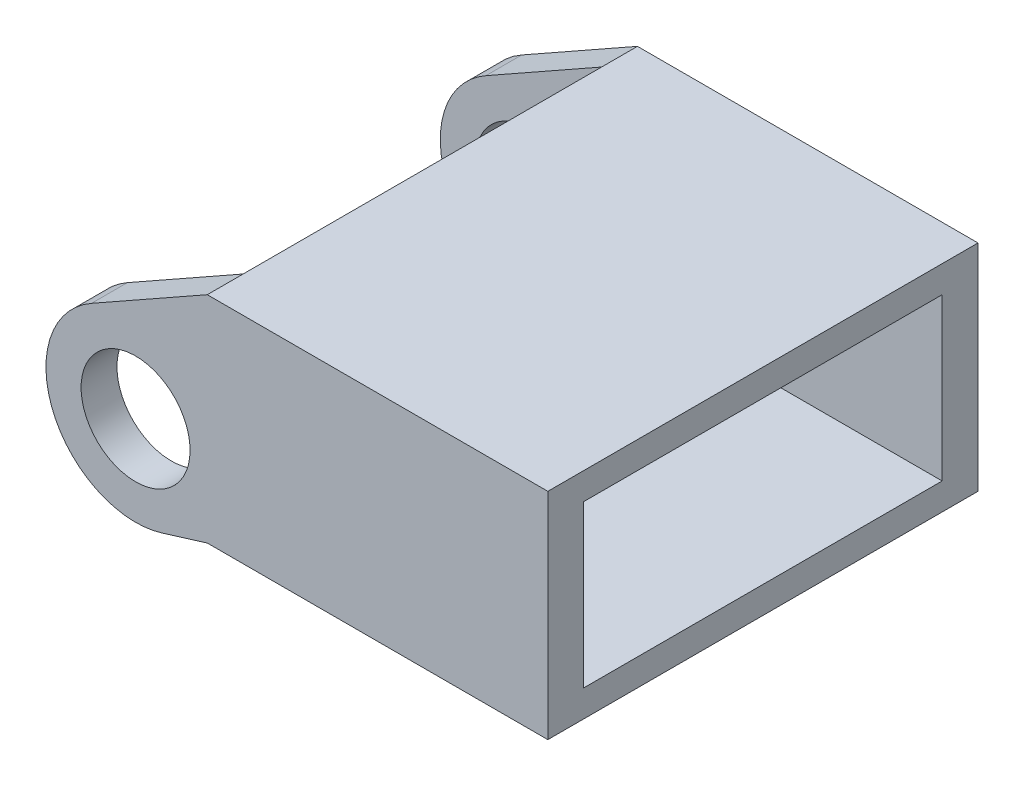
ISO-10303-21;
HEADER;
FILE_DESCRIPTION(('STEP AP214'),'2;1');
FILE_NAME('part.step','',(''),(''),'','','');
FILE_SCHEMA(('AUTOMOTIVE_DESIGN { 1 0 10303 214 1 1 1 1 }'));
ENDSEC;
DATA;
#1=APPLICATION_CONTEXT('core data for automotive mechanical design processes');
#2=APPLICATION_PROTOCOL_DEFINITION('international standard','automotive_design',2000,#1);
#3=PRODUCT_CONTEXT('',#1,'mechanical');
#4=PRODUCT('Part','Part','',(#3));
#5=PRODUCT_RELATED_PRODUCT_CATEGORY('part','',(#4));
#6=PRODUCT_DEFINITION_FORMATION('','',#4);
#7=PRODUCT_DEFINITION_CONTEXT('part definition',#1,'design');
#8=PRODUCT_DEFINITION('design','',#6,#7);
#9=PRODUCT_DEFINITION_SHAPE('','',#8);
#10=(LENGTH_UNIT() NAMED_UNIT(*) SI_UNIT(.MILLI.,.METRE.));
#11=(NAMED_UNIT(*) PLANE_ANGLE_UNIT() SI_UNIT($,.RADIAN.));
#12=(NAMED_UNIT(*) SI_UNIT($,.STERADIAN.) SOLID_ANGLE_UNIT());
#13=UNCERTAINTY_MEASURE_WITH_UNIT(LENGTH_MEASURE(1.E-05),#10,'distance_accuracy_value','');
#14=(GEOMETRIC_REPRESENTATION_CONTEXT(3) GLOBAL_UNCERTAINTY_ASSIGNED_CONTEXT((#13)) GLOBAL_UNIT_ASSIGNED_CONTEXT((#10,
#11,#12)) REPRESENTATION_CONTEXT('',''));
#15=CARTESIAN_POINT('',(0.,0.,0.));
#16=DIRECTION('',(0.,0.,1.));
#17=DIRECTION('',(1.,0.,0.));
#18=AXIS2_PLACEMENT_3D('',#15,#16,#17);
#19=CARTESIAN_POINT('',(-8.02828775789378,-2.4720377578938,76.2));
#20=DIRECTION('',(-0.294281086116927,0.955718913883073,0.));
#21=DIRECTION('',(-0.955718913883074,-0.294281086116927,0.));
#22=AXIS2_PLACEMENT_3D('',#19,#20,#21);
#23=PLANE('',#22);
#24=DIRECTION('',(0.,0.,-1.));
#25=VECTOR('',#24,1.);
#26=CARTESIAN_POINT('',(-8.02828775789378,-2.47203775789381,76.2));
#27=LINE('',#26,#25);
#28=CARTESIAN_POINT('',(-8.02828775789378,-2.47203775789381,76.2));
#29=VERTEX_POINT('',#28);
#30=CARTESIAN_POINT('',(-8.02828775789378,-2.47203775789381,69.85));
#31=VERTEX_POINT('',#30);
#32=EDGE_CURVE('E192',#29,#31,#27,.T.);
#33=ORIENTED_EDGE('',*,*,#32,.T.);
#34=DIRECTION('',(0.955718913883074,0.294281086116927,0.));
#35=VECTOR('',#34,1.);
#36=CARTESIAN_POINT('',(-8.02828775789378,-2.4720377578938,69.85));
#37=LINE('',#36,#35);
#38=CARTESIAN_POINT('',(0.,0.,69.85));
#39=VERTEX_POINT('',#38);
#40=EDGE_CURVE('E199',#31,#39,#37,.T.);
#41=ORIENTED_EDGE('',*,*,#40,.T.);
#42=DIRECTION('',(0.,0.,-1.));
#43=VECTOR('',#42,1.);
#44=CARTESIAN_POINT('',(0.,0.,76.2));
#45=LINE('',#44,#43);
#46=CARTESIAN_POINT('',(0.,0.,76.2));
#47=VERTEX_POINT('',#46);
#48=EDGE_CURVE('E183',#47,#39,#45,.T.);
#49=ORIENTED_EDGE('',*,*,#48,.F.);
#50=DIRECTION('',(0.955718913883074,0.294281086116927,0.));
#51=VECTOR('',#50,1.);
#52=CARTESIAN_POINT('',(-8.02828775789378,-2.4720377578938,76.2));
#53=LINE('',#52,#51);
#54=EDGE_CURVE('E209',#29,#47,#53,.T.);
#55=ORIENTED_EDGE('',*,*,#54,.F.);
#56=EDGE_LOOP('',(#33,#41,#49,#55));
#57=FACE_BOUND('',#56,.T.);
#58=ADVANCED_FACE('F35',(#57),#23,.F.);
#59=CARTESIAN_POINT('',(-20.5044650982644,26.5241075491322,76.2));
#60=DIRECTION('',(0.491619848709567,-0.870809924354783,0.));
#61=DIRECTION('',(0.870809924354783,0.491619848709567,0.));
#62=AXIS2_PLACEMENT_3D('',#59,#60,#61);
#63=PLANE('',#62);
#64=DIRECTION('',(0.,0.,-1.));
#65=VECTOR('',#64,1.);
#66=CARTESIAN_POINT('',(0.,38.1,76.2));
#67=LINE('',#66,#65);
#68=CARTESIAN_POINT('',(0.,38.1,76.2));
#69=VERTEX_POINT('',#68);
#70=CARTESIAN_POINT('',(0.,38.1,69.85));
#71=VERTEX_POINT('',#70);
#72=EDGE_CURVE('E170',#69,#71,#67,.T.);
#73=ORIENTED_EDGE('',*,*,#72,.T.);
#74=DIRECTION('',(-0.870809924354783,-0.491619848709567,0.));
#75=VECTOR('',#74,1.);
#76=CARTESIAN_POINT('',(-20.5044650982644,26.5241075491322,69.85));
#77=LINE('',#76,#75);
#78=CARTESIAN_POINT('',(-20.5044650982644,26.5241075491322,69.85));
#79=VERTEX_POINT('',#78);
#80=EDGE_CURVE('E147',#71,#79,#77,.T.);
#81=ORIENTED_EDGE('',*,*,#80,.T.);
#82=DIRECTION('',(0.,0.,-1.));
#83=VECTOR('',#82,1.);
#84=CARTESIAN_POINT('',(-20.5044650982644,26.5241075491322,76.2));
#85=LINE('',#84,#83);
#86=CARTESIAN_POINT('',(-20.5044650982644,26.5241075491322,76.2));
#87=VERTEX_POINT('',#86);
#88=EDGE_CURVE('E171',#87,#79,#85,.T.);
#89=ORIENTED_EDGE('',*,*,#88,.F.);
#90=DIRECTION('',(-0.870809924354783,-0.491619848709567,0.));
#91=VECTOR('',#90,1.);
#92=CARTESIAN_POINT('',(-20.5044650982644,26.5241075491322,76.2));
#93=LINE('',#92,#91);
#94=EDGE_CURVE('E226',#69,#87,#93,.T.);
#95=ORIENTED_EDGE('',*,*,#94,.F.);
#96=EDGE_LOOP('',(#73,#81,#89,#95));
#97=FACE_BOUND('',#96,.T.);
#98=ADVANCED_FACE('F289',(#97),#63,.F.);
#99=CARTESIAN_POINT('',(-12.7,12.7,76.2));
#100=DIRECTION('',(0.,0.,-1.));
#101=DIRECTION('',(-1.,0.,0.));
#102=AXIS2_PLACEMENT_3D('',#99,#100,#101);
#103=CYLINDRICAL_SURFACE('',#102,15.875);
#104=CARTESIAN_POINT('',(-8.02828775789378,-2.47203775789381,6.34999999999999));
#105=VERTEX_POINT('',#104);
#106=CARTESIAN_POINT('',(-8.02828775789378,-2.47203775789381,0.));
#107=VERTEX_POINT('',#106);
#108=EDGE_CURVE('E210',#105,#107,#27,.T.);
#109=ORIENTED_EDGE('',*,*,#108,.F.);
#110=CARTESIAN_POINT('',(-12.7,12.7,6.34999999999999));
#111=DIRECTION('',(0.,0.,-1.));
#112=DIRECTION('',(0.,1.,0.));
#113=AXIS2_PLACEMENT_3D('',#110,#111,#112);
#114=CIRCLE('',#113,15.875);
#115=CARTESIAN_POINT('',(-20.5044650982644,26.5241075491322,6.35));
#116=VERTEX_POINT('',#115);
#117=EDGE_CURVE('E11',#105,#116,#114,.T.);
#118=ORIENTED_EDGE('',*,*,#117,.T.);
#119=CARTESIAN_POINT('',(-20.5044650982644,26.5241075491322,0.));
#120=VERTEX_POINT('',#119);
#121=EDGE_CURVE('E145',#116,#120,#85,.T.);
#122=ORIENTED_EDGE('',*,*,#121,.T.);
#123=CARTESIAN_POINT('',(-12.7,12.7,0.));
#124=DIRECTION('',(0.,0.,1.));
#125=DIRECTION('',(1.,0.,0.));
#126=AXIS2_PLACEMENT_3D('',#123,#124,#125);
#127=CIRCLE('',#126,15.875);
#128=EDGE_CURVE('E213',#120,#107,#127,.T.);
#129=ORIENTED_EDGE('',*,*,#128,.T.);
#130=EDGE_LOOP('',(#109,#118,#122,#129));
#131=FACE_BOUND('',#130,.T.);
#132=ADVANCED_FACE('F293',(#131),#103,.T.);
#133=CARTESIAN_POINT('',(0.,0.,6.34999999999999));
#134=VERTEX_POINT('',#133);
#135=CARTESIAN_POINT('',(0.,0.,0.));
#136=VERTEX_POINT('',#135);
#137=EDGE_CURVE('E182',#134,#136,#45,.T.);
#138=ORIENTED_EDGE('',*,*,#137,.F.);
#139=DIRECTION('',(-0.955718913883074,-0.294281086116927,0.));
#140=VECTOR('',#139,1.);
#141=CARTESIAN_POINT('',(-8.02828775789379,-2.47203775789381,6.34999999999999));
#142=LINE('',#141,#140);
#143=EDGE_CURVE('E206',#134,#105,#142,.T.);
#144=ORIENTED_EDGE('',*,*,#143,.T.);
#145=ORIENTED_EDGE('',*,*,#108,.T.);
#146=DIRECTION('',(0.955718913883074,0.294281086116927,0.));
#147=VECTOR('',#146,1.);
#148=CARTESIAN_POINT('',(-8.02828775789378,-2.4720377578938,0.));
#149=LINE('',#148,#147);
#150=EDGE_CURVE('E146',#107,#136,#149,.T.);
#151=ORIENTED_EDGE('',*,*,#150,.T.);
#152=EDGE_LOOP('',(#138,#144,#145,#151));
#153=FACE_BOUND('',#152,.T.);
#154=ADVANCED_FACE('F37',(#153),#23,.F.);
#155=CARTESIAN_POINT('',(0.,0.,76.2));
#156=DIRECTION('',(0.,1.,0.));
#157=DIRECTION('',(0.,0.,1.));
#158=AXIS2_PLACEMENT_3D('',#155,#156,#157);
#159=PLANE('',#158);
#160=DIRECTION('',(1.,0.,0.));
#161=VECTOR('',#160,1.);
#162=CARTESIAN_POINT('',(0.,0.,0.));
#163=LINE('',#162,#161);
#164=CARTESIAN_POINT('',(60.325,0.,0.));
#165=VERTEX_POINT('',#164);
#166=EDGE_CURVE('E221',#136,#165,#163,.T.);
#167=ORIENTED_EDGE('',*,*,#166,.T.);
#168=DIRECTION('',(0.,0.,-1.));
#169=VECTOR('',#168,1.);
#170=CARTESIAN_POINT('',(60.325,0.,76.2));
#171=LINE('',#170,#169);
#172=CARTESIAN_POINT('',(60.325,0.,76.2));
#173=VERTEX_POINT('',#172);
#174=EDGE_CURVE('E179',#173,#165,#171,.T.);
#175=ORIENTED_EDGE('',*,*,#174,.F.);
#176=DIRECTION('',(1.,0.,0.));
#177=VECTOR('',#176,1.);
#178=CARTESIAN_POINT('',(0.,0.,76.2));
#179=LINE('',#178,#177);
#180=EDGE_CURVE('E232',#47,#173,#179,.T.);
#181=ORIENTED_EDGE('',*,*,#180,.F.);
#182=ORIENTED_EDGE('',*,*,#48,.T.);
#183=DIRECTION('',(0.,0.,-1.));
#184=VECTOR('',#183,1.);
#185=CARTESIAN_POINT('',(0.,0.,76.2));
#186=LINE('',#185,#184);
#187=EDGE_CURVE('E254',#39,#134,#186,.T.);
#188=ORIENTED_EDGE('',*,*,#187,.T.);
#189=ORIENTED_EDGE('',*,*,#137,.T.);
#190=EDGE_LOOP('',(#167,#175,#181,#182,#188,#189));
#191=FACE_BOUND('',#190,.T.);
#192=ADVANCED_FACE('F297',(#191),#159,.F.);
#193=CARTESIAN_POINT('',(60.325,0.,76.2));
#194=DIRECTION('',(-1.,0.,0.));
#195=DIRECTION('',(0.,0.,1.));
#196=AXIS2_PLACEMENT_3D('',#193,#194,#195);
#197=PLANE('',#196);
#198=DIRECTION('',(0.,0.,1.));
#199=VECTOR('',#198,1.);
#200=CARTESIAN_POINT('',(60.325,33.3375,6.35));
#201=LINE('',#200,#199);
#202=CARTESIAN_POINT('',(60.325,33.3375,6.35000000000001));
#203=VERTEX_POINT('',#202);
#204=CARTESIAN_POINT('',(60.325,33.3375,69.85));
#205=VERTEX_POINT('',#204);
#206=EDGE_CURVE('E249',#203,#205,#201,.T.);
#207=ORIENTED_EDGE('',*,*,#206,.F.);
#208=DIRECTION('',(0.,1.,0.));
#209=VECTOR('',#208,1.);
#210=CARTESIAN_POINT('',(60.325,33.3375,6.35));
#211=LINE('',#210,#209);
#212=CARTESIAN_POINT('',(60.325,4.7625,6.35));
#213=VERTEX_POINT('',#212);
#214=EDGE_CURVE('E205',#213,#203,#211,.T.);
#215=ORIENTED_EDGE('',*,*,#214,.F.);
#216=DIRECTION('',(0.,0.,-1.));
#217=VECTOR('',#216,1.);
#218=CARTESIAN_POINT('',(60.325,4.7625,6.35));
#219=LINE('',#218,#217);
#220=CARTESIAN_POINT('',(60.325,4.76249999999999,69.85));
#221=VERTEX_POINT('',#220);
#222=EDGE_CURVE('E239',#221,#213,#219,.T.);
#223=ORIENTED_EDGE('',*,*,#222,.F.);
#224=DIRECTION('',(0.,-1.,0.));
#225=VECTOR('',#224,1.);
#226=CARTESIAN_POINT('',(60.325,33.3375,69.85));
#227=LINE('',#226,#225);
#228=EDGE_CURVE('E246',#205,#221,#227,.T.);
#229=ORIENTED_EDGE('',*,*,#228,.F.);
#230=EDGE_LOOP('',(#207,#215,#223,#229));
#231=FACE_BOUND('',#230,.T.);
#232=DIRECTION('',(0.,1.,0.));
#233=VECTOR('',#232,1.);
#234=CARTESIAN_POINT('',(60.325,0.,0.));
#235=LINE('',#234,#233);
#236=CARTESIAN_POINT('',(60.325,38.1,0.));
#237=VERTEX_POINT('',#236);
#238=EDGE_CURVE('E219',#165,#237,#235,.T.);
#239=ORIENTED_EDGE('',*,*,#238,.T.);
#240=DIRECTION('',(0.,0.,-1.));
#241=VECTOR('',#240,1.);
#242=CARTESIAN_POINT('',(60.325,38.1,76.2));
#243=LINE('',#242,#241);
#244=CARTESIAN_POINT('',(60.325,38.1,76.2));
#245=VERTEX_POINT('',#244);
#246=EDGE_CURVE('E173',#245,#237,#243,.T.);
#247=ORIENTED_EDGE('',*,*,#246,.F.);
#248=DIRECTION('',(0.,1.,0.));
#249=VECTOR('',#248,1.);
#250=CARTESIAN_POINT('',(60.325,0.,76.2));
#251=LINE('',#250,#249);
#252=EDGE_CURVE('E230',#173,#245,#251,.T.);
#253=ORIENTED_EDGE('',*,*,#252,.F.);
#254=ORIENTED_EDGE('',*,*,#174,.T.);
#255=EDGE_LOOP('',(#239,#247,#253,#254));
#256=FACE_BOUND('',#255,.T.);
#257=ADVANCED_FACE('F303',(#231,#256),#197,.F.);
#258=CARTESIAN_POINT('',(0.,38.1,76.2));
#259=DIRECTION('',(0.,-1.,0.));
#260=DIRECTION('',(0.,0.,-1.));
#261=AXIS2_PLACEMENT_3D('',#258,#259,#260);
#262=PLANE('',#261);
#263=DIRECTION('',(-1.,0.,0.));
#264=VECTOR('',#263,1.);
#265=CARTESIAN_POINT('',(0.,38.1,0.));
#266=LINE('',#265,#264);
#267=CARTESIAN_POINT('',(0.,38.1,0.));
#268=VERTEX_POINT('',#267);
#269=EDGE_CURVE('E168',#237,#268,#266,.T.);
#270=ORIENTED_EDGE('',*,*,#269,.T.);
#271=CARTESIAN_POINT('',(0.,38.1,6.34999999999999));
#272=VERTEX_POINT('',#271);
#273=EDGE_CURVE('E143',#272,#268,#67,.T.);
#274=ORIENTED_EDGE('',*,*,#273,.F.);
#275=DIRECTION('',(0.,0.,-1.));
#276=VECTOR('',#275,1.);
#277=CARTESIAN_POINT('',(0.,38.1,6.34999999999999));
#278=LINE('',#277,#276);
#279=EDGE_CURVE('E153',#71,#272,#278,.T.);
#280=ORIENTED_EDGE('',*,*,#279,.F.);
#281=ORIENTED_EDGE('',*,*,#72,.F.);
#282=DIRECTION('',(-1.,0.,0.));
#283=VECTOR('',#282,1.);
#284=CARTESIAN_POINT('',(0.,38.1,76.2));
#285=LINE('',#284,#283);
#286=EDGE_CURVE('E228',#245,#69,#285,.T.);
#287=ORIENTED_EDGE('',*,*,#286,.F.);
#288=ORIENTED_EDGE('',*,*,#246,.T.);
#289=EDGE_LOOP('',(#270,#274,#280,#281,#287,#288));
#290=FACE_BOUND('',#289,.T.);
#291=ADVANCED_FACE('F165',(#290),#262,.F.);
#292=DIRECTION('',(0.870809924354783,0.491619848709567,0.));
#293=VECTOR('',#292,1.);
#294=CARTESIAN_POINT('',(-20.5044650982644,26.5241075491322,6.34999999999999));
#295=LINE('',#294,#293);
#296=EDGE_CURVE('E138',#116,#272,#295,.T.);
#297=ORIENTED_EDGE('',*,*,#296,.T.);
#298=ORIENTED_EDGE('',*,*,#273,.T.);
#299=DIRECTION('',(-0.870809924354783,-0.491619848709567,0.));
#300=VECTOR('',#299,1.);
#301=CARTESIAN_POINT('',(-20.5044650982644,26.5241075491322,0.));
#302=LINE('',#301,#300);
#303=EDGE_CURVE('E216',#268,#120,#302,.T.);
#304=ORIENTED_EDGE('',*,*,#303,.T.);
#305=ORIENTED_EDGE('',*,*,#121,.F.);
#306=EDGE_LOOP('',(#297,#298,#304,#305));
#307=FACE_BOUND('',#306,.T.);
#308=ADVANCED_FACE('F140',(#307),#63,.F.);
#309=CARTESIAN_POINT('',(-12.7,12.7,69.85));
#310=DIRECTION('',(0.,0.,1.));
#311=DIRECTION('',(1.,0.,0.));
#312=AXIS2_PLACEMENT_3D('',#309,#310,#311);
#313=CIRCLE('',#312,15.875);
#314=EDGE_CURVE('E44',#79,#31,#313,.T.);
#315=ORIENTED_EDGE('',*,*,#314,.T.);
#316=ORIENTED_EDGE('',*,*,#32,.F.);
#317=CARTESIAN_POINT('',(-12.7,12.7,76.2));
#318=DIRECTION('',(0.,0.,1.));
#319=DIRECTION('',(1.,0.,0.));
#320=AXIS2_PLACEMENT_3D('',#317,#318,#319);
#321=CIRCLE('',#320,15.875);
#322=EDGE_CURVE('E211',#87,#29,#321,.T.);
#323=ORIENTED_EDGE('',*,*,#322,.F.);
#324=ORIENTED_EDGE('',*,*,#88,.T.);
#325=EDGE_LOOP('',(#315,#316,#323,#324));
#326=FACE_BOUND('',#325,.T.);
#327=ADVANCED_FACE('F189',(#326),#103,.T.);
#328=CARTESIAN_POINT('',(-12.7,12.7,76.2));
#329=DIRECTION('',(0.,0.,1.));
#330=DIRECTION('',(1.,0.,0.));
#331=AXIS2_PLACEMENT_3D('',#328,#329,#330);
#332=PLANE('',#331);
#333=CARTESIAN_POINT('',(-12.7,12.7,76.2));
#334=DIRECTION('',(0.,0.,1.));
#335=DIRECTION('',(1.,0.,0.));
#336=AXIS2_PLACEMENT_3D('',#333,#334,#335);
#337=CIRCLE('',#336,9.652);
#338=CARTESIAN_POINT('',(-3.048,12.7,76.2));
#339=VERTEX_POINT('',#338);
#340=EDGE_CURVE('E265',#339,#339,#337,.T.);
#341=ORIENTED_EDGE('',*,*,#340,.F.);
#342=EDGE_LOOP('',(#341));
#343=FACE_BOUND('',#342,.T.);
#344=ORIENTED_EDGE('',*,*,#54,.T.);
#345=ORIENTED_EDGE('',*,*,#180,.T.);
#346=ORIENTED_EDGE('',*,*,#252,.T.);
#347=ORIENTED_EDGE('',*,*,#286,.T.);
#348=ORIENTED_EDGE('',*,*,#94,.T.);
#349=ORIENTED_EDGE('',*,*,#322,.T.);
#350=EDGE_LOOP('',(#344,#345,#346,#347,#348,#349));
#351=FACE_BOUND('',#350,.T.);
#352=ADVANCED_FACE('F327',(#343,#351),#332,.T.);
#353=CARTESIAN_POINT('',(-12.7,12.7,0.));
#354=DIRECTION('',(0.,0.,1.));
#355=DIRECTION('',(1.,0.,0.));
#356=AXIS2_PLACEMENT_3D('',#353,#354,#355);
#357=PLANE('',#356);
#358=CARTESIAN_POINT('',(-12.7,12.7,0.));
#359=DIRECTION('',(0.,0.,1.));
#360=DIRECTION('',(1.,0.,0.));
#361=AXIS2_PLACEMENT_3D('',#358,#359,#360);
#362=CIRCLE('',#361,9.652);
#363=CARTESIAN_POINT('',(-3.048,12.7,0.));
#364=VERTEX_POINT('',#363);
#365=EDGE_CURVE('E268',#364,#364,#362,.T.);
#366=ORIENTED_EDGE('',*,*,#365,.T.);
#367=EDGE_LOOP('',(#366));
#368=FACE_BOUND('',#367,.T.);
#369=ORIENTED_EDGE('',*,*,#150,.F.);
#370=ORIENTED_EDGE('',*,*,#128,.F.);
#371=ORIENTED_EDGE('',*,*,#303,.F.);
#372=ORIENTED_EDGE('',*,*,#269,.F.);
#373=ORIENTED_EDGE('',*,*,#238,.F.);
#374=ORIENTED_EDGE('',*,*,#166,.F.);
#375=EDGE_LOOP('',(#369,#370,#371,#372,#373,#374));
#376=FACE_BOUND('',#375,.T.);
#377=ADVANCED_FACE('F332',(#368,#376),#357,.F.);
#378=CARTESIAN_POINT('',(-28.575,33.3375,6.35));
#379=DIRECTION('',(0.,1.,0.));
#380=DIRECTION('',(0.,0.,1.));
#381=AXIS2_PLACEMENT_3D('',#378,#379,#380);
#382=PLANE('',#381);
#383=DIRECTION('',(1.,0.,0.));
#384=VECTOR('',#383,1.);
#385=CARTESIAN_POINT('',(-28.575,33.3375,69.85));
#386=LINE('',#385,#384);
#387=CARTESIAN_POINT('',(0.,33.3375,69.85));
#388=VERTEX_POINT('',#387);
#389=EDGE_CURVE('E238',#388,#205,#386,.T.);
#390=ORIENTED_EDGE('',*,*,#389,.F.);
#391=DIRECTION('',(0.,0.,-1.));
#392=VECTOR('',#391,1.);
#393=CARTESIAN_POINT('',(0.,33.3375,6.35));
#394=LINE('',#393,#392);
#395=CARTESIAN_POINT('',(0.,33.3375,6.34999999999999));
#396=VERTEX_POINT('',#395);
#397=EDGE_CURVE('E257',#388,#396,#394,.T.);
#398=ORIENTED_EDGE('',*,*,#397,.T.);
#399=DIRECTION('',(1.,0.,0.));
#400=VECTOR('',#399,1.);
#401=CARTESIAN_POINT('',(-28.575,33.3375,6.35));
#402=LINE('',#401,#400);
#403=EDGE_CURVE('E59',#396,#203,#402,.T.);
#404=ORIENTED_EDGE('',*,*,#403,.T.);
#405=ORIENTED_EDGE('',*,*,#206,.T.);
#406=EDGE_LOOP('',(#390,#398,#404,#405));
#407=FACE_BOUND('',#406,.T.);
#408=ADVANCED_FACE('F322',(#407),#382,.F.);
#409=CARTESIAN_POINT('',(-28.575,33.3375,6.35));
#410=DIRECTION('',(0.,0.,-1.));
#411=DIRECTION('',(0.,1.,0.));
#412=AXIS2_PLACEMENT_3D('',#409,#410,#411);
#413=PLANE('',#412);
#414=CARTESIAN_POINT('',(-12.7,12.7,6.35));
#415=DIRECTION('',(0.,0.,-1.));
#416=DIRECTION('',(0.,1.,0.));
#417=AXIS2_PLACEMENT_3D('',#414,#415,#416);
#418=CIRCLE('',#417,9.652);
#419=CARTESIAN_POINT('',(-3.048,12.7,6.35));
#420=VERTEX_POINT('',#419);
#421=EDGE_CURVE('E163',#420,#420,#418,.T.);
#422=ORIENTED_EDGE('',*,*,#421,.T.);
#423=EDGE_LOOP('',(#422));
#424=FACE_BOUND('',#423,.T.);
#425=ORIENTED_EDGE('',*,*,#403,.F.);
#426=DIRECTION('',(0.,1.,0.));
#427=VECTOR('',#426,1.);
#428=CARTESIAN_POINT('',(0.,-3.17500000000002,6.34999999999999));
#429=LINE('',#428,#427);
#430=EDGE_CURVE('E149',#396,#272,#429,.T.);
#431=ORIENTED_EDGE('',*,*,#430,.T.);
#432=ORIENTED_EDGE('',*,*,#296,.F.);
#433=ORIENTED_EDGE('',*,*,#117,.F.);
#434=ORIENTED_EDGE('',*,*,#143,.F.);
#435=CARTESIAN_POINT('',(0.,4.7625,6.35));
#436=VERTEX_POINT('',#435);
#437=EDGE_CURVE('E51',#134,#436,#429,.T.);
#438=ORIENTED_EDGE('',*,*,#437,.T.);
#439=DIRECTION('',(1.,0.,0.));
#440=VECTOR('',#439,1.);
#441=CARTESIAN_POINT('',(-28.575,4.7625,6.35));
#442=LINE('',#441,#440);
#443=EDGE_CURVE('E236',#436,#213,#442,.T.);
#444=ORIENTED_EDGE('',*,*,#443,.T.);
#445=ORIENTED_EDGE('',*,*,#214,.T.);
#446=EDGE_LOOP('',(#425,#431,#432,#433,#434,#438,#444,#445));
#447=FACE_BOUND('',#446,.T.);
#448=ADVANCED_FACE('F151',(#424,#447),#413,.F.);
#449=CARTESIAN_POINT('',(-28.575,4.7625,6.35));
#450=DIRECTION('',(0.,-1.,0.));
#451=DIRECTION('',(0.,0.,-1.));
#452=AXIS2_PLACEMENT_3D('',#449,#450,#451);
#453=PLANE('',#452);
#454=ORIENTED_EDGE('',*,*,#443,.F.);
#455=DIRECTION('',(0.,0.,1.));
#456=VECTOR('',#455,1.);
#457=CARTESIAN_POINT('',(0.,4.7625,6.34999999999999));
#458=LINE('',#457,#456);
#459=CARTESIAN_POINT('',(0.,4.7625,69.85));
#460=VERTEX_POINT('',#459);
#461=EDGE_CURVE('E259',#436,#460,#458,.T.);
#462=ORIENTED_EDGE('',*,*,#461,.T.);
#463=DIRECTION('',(1.,0.,0.));
#464=VECTOR('',#463,1.);
#465=CARTESIAN_POINT('',(-28.575,4.76249999999999,69.85));
#466=LINE('',#465,#464);
#467=EDGE_CURVE('E241',#460,#221,#466,.T.);
#468=ORIENTED_EDGE('',*,*,#467,.T.);
#469=ORIENTED_EDGE('',*,*,#222,.T.);
#470=EDGE_LOOP('',(#454,#462,#468,#469));
#471=FACE_BOUND('',#470,.T.);
#472=ADVANCED_FACE('F314',(#471),#453,.F.);
#473=CARTESIAN_POINT('',(-28.575,33.3375,69.85));
#474=DIRECTION('',(0.,0.,1.));
#475=DIRECTION('',(1.,0.,0.));
#476=AXIS2_PLACEMENT_3D('',#473,#474,#475);
#477=PLANE('',#476);
#478=CARTESIAN_POINT('',(-12.7,12.7,69.85));
#479=DIRECTION('',(0.,0.,1.));
#480=DIRECTION('',(1.,0.,0.));
#481=AXIS2_PLACEMENT_3D('',#478,#479,#480);
#482=CIRCLE('',#481,9.652);
#483=CARTESIAN_POINT('',(-3.048,12.7,69.85));
#484=VERTEX_POINT('',#483);
#485=EDGE_CURVE('E39',#484,#484,#482,.T.);
#486=ORIENTED_EDGE('',*,*,#485,.T.);
#487=EDGE_LOOP('',(#486));
#488=FACE_BOUND('',#487,.T.);
#489=ORIENTED_EDGE('',*,*,#467,.F.);
#490=DIRECTION('',(0.,1.,0.));
#491=VECTOR('',#490,1.);
#492=CARTESIAN_POINT('',(0.,-3.17500000000002,69.85));
#493=LINE('',#492,#491);
#494=EDGE_CURVE('E202',#39,#460,#493,.T.);
#495=ORIENTED_EDGE('',*,*,#494,.F.);
#496=ORIENTED_EDGE('',*,*,#40,.F.);
#497=ORIENTED_EDGE('',*,*,#314,.F.);
#498=ORIENTED_EDGE('',*,*,#80,.F.);
#499=EDGE_CURVE('E159',#388,#71,#493,.T.);
#500=ORIENTED_EDGE('',*,*,#499,.F.);
#501=ORIENTED_EDGE('',*,*,#389,.T.);
#502=ORIENTED_EDGE('',*,*,#228,.T.);
#503=EDGE_LOOP('',(#489,#495,#496,#497,#498,#500,#501,#502));
#504=FACE_BOUND('',#503,.T.);
#505=ADVANCED_FACE('F201',(#488,#504),#477,.F.);
#506=CARTESIAN_POINT('',(0.,-3.17500000000002,6.34999999999999));
#507=DIRECTION('',(1.,0.,0.));
#508=DIRECTION('',(0.,0.,-1.));
#509=AXIS2_PLACEMENT_3D('',#506,#507,#508);
#510=PLANE('',#509);
#511=ORIENTED_EDGE('',*,*,#494,.T.);
#512=ORIENTED_EDGE('',*,*,#461,.F.);
#513=ORIENTED_EDGE('',*,*,#437,.F.);
#514=ORIENTED_EDGE('',*,*,#187,.F.);
#515=EDGE_LOOP('',(#511,#512,#513,#514));
#516=FACE_BOUND('',#515,.T.);
#517=ADVANCED_FACE('F286',(#516),#510,.F.);
#518=ORIENTED_EDGE('',*,*,#499,.T.);
#519=ORIENTED_EDGE('',*,*,#279,.T.);
#520=ORIENTED_EDGE('',*,*,#430,.F.);
#521=ORIENTED_EDGE('',*,*,#397,.F.);
#522=EDGE_LOOP('',(#518,#519,#520,#521));
#523=FACE_BOUND('',#522,.T.);
#524=ADVANCED_FACE('F157',(#523),#510,.F.);
#525=CARTESIAN_POINT('',(-12.7,12.7,0.));
#526=DIRECTION('',(0.,0.,1.));
#527=DIRECTION('',(1.,0.,0.));
#528=AXIS2_PLACEMENT_3D('',#525,#526,#527);
#529=CYLINDRICAL_SURFACE('',#528,9.652);
#530=CARTESIAN_POINT('',(-3.048,12.7,76.2));
#531=CARTESIAN_POINT('',(-3.048,12.7,76.1338541666667));
#532=CARTESIAN_POINT('',(-3.048,12.7,76.0677083333333));
#533=CARTESIAN_POINT('',(-3.048,12.7,75.9354166666667));
#534=CARTESIAN_POINT('',(-3.048,12.7,75.8692708333333));
#535=CARTESIAN_POINT('',(-3.048,12.7,75.7369791666667));
#536=CARTESIAN_POINT('',(-3.048,12.7,75.6708333333333));
#537=CARTESIAN_POINT('',(-3.048,12.7,75.5385416666667));
#538=CARTESIAN_POINT('',(-3.048,12.7,75.4723958333334));
#539=CARTESIAN_POINT('',(-3.048,12.7,75.3401041666667));
#540=CARTESIAN_POINT('',(-3.048,12.7,75.2739583333333));
#541=CARTESIAN_POINT('',(-3.048,12.7,75.1416666666667));
#542=CARTESIAN_POINT('',(-3.048,12.7,75.0755208333333));
#543=CARTESIAN_POINT('',(-3.048,12.7,74.9432291666667));
#544=CARTESIAN_POINT('',(-3.048,12.7,74.8770833333333));
#545=CARTESIAN_POINT('',(-3.048,12.7,74.7447916666667));
#546=CARTESIAN_POINT('',(-3.048,12.7,74.6786458333333));
#547=CARTESIAN_POINT('',(-3.048,12.7,74.5463541666667));
#548=CARTESIAN_POINT('',(-3.048,12.7,74.4802083333333));
#549=CARTESIAN_POINT('',(-3.048,12.7,74.3479166666667));
#550=CARTESIAN_POINT('',(-3.048,12.7,74.2817708333333));
#551=CARTESIAN_POINT('',(-3.048,12.7,74.1494791666667));
#552=CARTESIAN_POINT('',(-3.048,12.7,74.0833333333333));
#553=CARTESIAN_POINT('',(-3.048,12.7,73.9510416666667));
#554=CARTESIAN_POINT('',(-3.048,12.7,73.8848958333333));
#555=CARTESIAN_POINT('',(-3.048,12.7,73.7526041666667));
#556=CARTESIAN_POINT('',(-3.048,12.7,73.6864583333333));
#557=CARTESIAN_POINT('',(-3.048,12.7,73.5541666666667));
#558=CARTESIAN_POINT('',(-3.048,12.7,73.4880208333334));
#559=CARTESIAN_POINT('',(-3.048,12.7,73.3557291666667));
#560=CARTESIAN_POINT('',(-3.048,12.7,73.2895833333333));
#561=CARTESIAN_POINT('',(-3.048,12.7,73.1572916666667));
#562=CARTESIAN_POINT('',(-3.048,12.7,73.0911458333333));
#563=CARTESIAN_POINT('',(-3.048,12.7,72.9588541666667));
#564=CARTESIAN_POINT('',(-3.048,12.7,72.8927083333333));
#565=CARTESIAN_POINT('',(-3.048,12.7,72.7604166666667));
#566=CARTESIAN_POINT('',(-3.048,12.7,72.6942708333333));
#567=CARTESIAN_POINT('',(-3.048,12.7,72.5619791666667));
#568=CARTESIAN_POINT('',(-3.048,12.7,72.4958333333333));
#569=CARTESIAN_POINT('',(-3.048,12.7,72.3635416666667));
#570=CARTESIAN_POINT('',(-3.048,12.7,72.2973958333334));
#571=CARTESIAN_POINT('',(-3.048,12.7,72.1651041666667));
#572=CARTESIAN_POINT('',(-3.048,12.7,72.0989583333333));
#573=CARTESIAN_POINT('',(-3.048,12.7,71.9666666666667));
#574=CARTESIAN_POINT('',(-3.048,12.7,71.9005208333333));
#575=CARTESIAN_POINT('',(-3.048,12.7,71.7682291666667));
#576=CARTESIAN_POINT('',(-3.048,12.7,71.7020833333333));
#577=CARTESIAN_POINT('',(-3.048,12.7,71.5697916666667));
#578=CARTESIAN_POINT('',(-3.048,12.7,71.5036458333333));
#579=CARTESIAN_POINT('',(-3.048,12.7,71.3713541666667));
#580=CARTESIAN_POINT('',(-3.048,12.7,71.3052083333333));
#581=CARTESIAN_POINT('',(-3.048,12.7,71.1729166666667));
#582=CARTESIAN_POINT('',(-3.048,12.7,71.1067708333333));
#583=CARTESIAN_POINT('',(-3.048,12.7,70.9744791666667));
#584=CARTESIAN_POINT('',(-3.048,12.7,70.9083333333333));
#585=CARTESIAN_POINT('',(-3.048,12.7,70.7760416666667));
#586=CARTESIAN_POINT('',(-3.048,12.7,70.7098958333333));
#587=CARTESIAN_POINT('',(-3.048,12.7,70.5776041666667));
#588=CARTESIAN_POINT('',(-3.048,12.7,70.5114583333334));
#589=CARTESIAN_POINT('',(-3.048,12.7,70.3791666666667));
#590=CARTESIAN_POINT('',(-3.048,12.7,70.3130208333334));
#591=CARTESIAN_POINT('',(-3.048,12.7,70.1807291666667));
#592=CARTESIAN_POINT('',(-3.048,12.7,70.1145833333333));
#593=CARTESIAN_POINT('',(-3.048,12.7,69.9822916666667));
#594=CARTESIAN_POINT('',(-3.048,12.7,69.9161458333333));
#595=CARTESIAN_POINT('',(-3.048,12.7,69.85));
#596=B_SPLINE_CURVE_WITH_KNOTS('',3,(#530,#531,#532,#533,#534,#535,#536,#537,#538,#539,#540,
#541,#542,#543,#544,#545,#546,#547,#548,#549,#550,#551,#552,#553,#554,#555,#556,#557,#558,#559,
#560,#561,#562,#563,#564,#565,#566,#567,#568,#569,#570,#571,#572,#573,#574,#575,#576,#577,#578,
#579,#580,#581,#582,#583,#584,#585,#586,#587,#588,#589,#590,#591,#592,#593,#594,#595),
.UNSPECIFIED.,.F.,.F.,(4,2,2,2,2,2,2,2,2,2,2,2,2,2,2,2,2,2,2,2,2,2,2,2,2,2,2,2,2,2,2,2,4),(0.,
0.198437499999995,0.396875000000005,0.5953125,0.793749999999996,0.992187500000005,1.190625,
1.3890625,1.58749999999999,1.7859375,1.984375,2.18281249999999,2.38125,2.5796875,
2.77812499999999,2.9765625,3.175,3.37343749999999,3.571875,3.7703125,3.96874999999999,4.1671875,
4.365625,4.56406249999999,4.7625,4.9609375,5.15937499999999,5.35781249999999,5.55625,
5.75468749999999,5.95312499999999,6.1515625,6.34999999999999),.UNSPECIFIED.);
#597=EDGE_CURVE('BSEAM276',#339,#484,#596,.T.);
#598=ORIENTED_EDGE('',*,*,#340,.T.);
#599=ORIENTED_EDGE('',*,*,#485,.F.);
#600=ORIENTED_EDGE('',*,*,#597,.T.);
#601=ORIENTED_EDGE('',*,*,#597,.F.);
#602=EDGE_LOOP('',(#598,#600,#599,#601));
#603=FACE_BOUND('',#602,.T.);
#604=ADVANCED_FACE('F276',(#603),#529,.F.);
#605=CARTESIAN_POINT('',(-3.048,12.7,0.));
#606=CARTESIAN_POINT('',(-3.048,12.7,0.0661458333333332));
#607=CARTESIAN_POINT('',(-3.048,12.7,0.132291666666667));
#608=CARTESIAN_POINT('',(-3.048,12.7,0.264583333333333));
#609=CARTESIAN_POINT('',(-3.048,12.7,0.330729166666667));
#610=CARTESIAN_POINT('',(-3.048,12.7,0.463020833333333));
#611=CARTESIAN_POINT('',(-3.048,12.7,0.529166666666666));
#612=CARTESIAN_POINT('',(-3.048,12.7,0.661458333333333));
#613=CARTESIAN_POINT('',(-3.048,12.7,0.727604166666666));
#614=CARTESIAN_POINT('',(-3.048,12.7,0.859895833333333));
#615=CARTESIAN_POINT('',(-3.048,12.7,0.926041666666666));
#616=CARTESIAN_POINT('',(-3.048,12.7,1.05833333333333));
#617=CARTESIAN_POINT('',(-3.048,12.7,1.12447916666667));
#618=CARTESIAN_POINT('',(-3.048,12.7,1.25677083333333));
#619=CARTESIAN_POINT('',(-3.048,12.7,1.32291666666667));
#620=CARTESIAN_POINT('',(-3.048,12.7,1.45520833333333));
#621=CARTESIAN_POINT('',(-3.048,12.7,1.52135416666667));
#622=CARTESIAN_POINT('',(-3.048,12.7,1.65364583333333));
#623=CARTESIAN_POINT('',(-3.048,12.7,1.71979166666667));
#624=CARTESIAN_POINT('',(-3.048,12.7,1.85208333333333));
#625=CARTESIAN_POINT('',(-3.048,12.7,1.91822916666667));
#626=CARTESIAN_POINT('',(-3.048,12.7,2.05052083333333));
#627=CARTESIAN_POINT('',(-3.048,12.7,2.11666666666667));
#628=CARTESIAN_POINT('',(-3.048,12.7,2.24895833333333));
#629=CARTESIAN_POINT('',(-3.048,12.7,2.31510416666667));
#630=CARTESIAN_POINT('',(-3.048,12.7,2.44739583333333));
#631=CARTESIAN_POINT('',(-3.048,12.7,2.51354166666667));
#632=CARTESIAN_POINT('',(-3.048,12.7,2.64583333333333));
#633=CARTESIAN_POINT('',(-3.048,12.7,2.71197916666667));
#634=CARTESIAN_POINT('',(-3.048,12.7,2.84427083333333));
#635=CARTESIAN_POINT('',(-3.048,12.7,2.91041666666667));
#636=CARTESIAN_POINT('',(-3.048,12.7,3.04270833333333));
#637=CARTESIAN_POINT('',(-3.048,12.7,3.10885416666667));
#638=CARTESIAN_POINT('',(-3.048,12.7,3.24114583333333));
#639=CARTESIAN_POINT('',(-3.048,12.7,3.30729166666667));
#640=CARTESIAN_POINT('',(-3.048,12.7,3.43958333333333));
#641=CARTESIAN_POINT('',(-3.048,12.7,3.50572916666667));
#642=CARTESIAN_POINT('',(-3.048,12.7,3.63802083333333));
#643=CARTESIAN_POINT('',(-3.048,12.7,3.70416666666667));
#644=CARTESIAN_POINT('',(-3.048,12.7,3.83645833333333));
#645=CARTESIAN_POINT('',(-3.048,12.7,3.90260416666666));
#646=CARTESIAN_POINT('',(-3.048,12.7,4.03489583333333));
#647=CARTESIAN_POINT('',(-3.048,12.7,4.10104166666666));
#648=CARTESIAN_POINT('',(-3.048,12.7,4.23333333333333));
#649=CARTESIAN_POINT('',(-3.048,12.7,4.29947916666667));
#650=CARTESIAN_POINT('',(-3.048,12.7,4.43177083333333));
#651=CARTESIAN_POINT('',(-3.048,12.7,4.49791666666667));
#652=CARTESIAN_POINT('',(-3.048,12.7,4.63020833333333));
#653=CARTESIAN_POINT('',(-3.048,12.7,4.69635416666666));
#654=CARTESIAN_POINT('',(-3.048,12.7,4.82864583333333));
#655=CARTESIAN_POINT('',(-3.048,12.7,4.89479166666666));
#656=CARTESIAN_POINT('',(-3.048,12.7,5.02708333333333));
#657=CARTESIAN_POINT('',(-3.048,12.7,5.09322916666666));
#658=CARTESIAN_POINT('',(-3.048,12.7,5.22552083333333));
#659=CARTESIAN_POINT('',(-3.048,12.7,5.29166666666666));
#660=CARTESIAN_POINT('',(-3.048,12.7,5.42395833333333));
#661=CARTESIAN_POINT('',(-3.048,12.7,5.49010416666666));
#662=CARTESIAN_POINT('',(-3.048,12.7,5.62239583333333));
#663=CARTESIAN_POINT('',(-3.048,12.7,5.68854166666666));
#664=CARTESIAN_POINT('',(-3.048,12.7,5.82083333333333));
#665=CARTESIAN_POINT('',(-3.048,12.7,5.88697916666666));
#666=CARTESIAN_POINT('',(-3.048,12.7,6.01927083333333));
#667=CARTESIAN_POINT('',(-3.048,12.7,6.08541666666666));
#668=CARTESIAN_POINT('',(-3.048,12.7,6.21770833333333));
#669=CARTESIAN_POINT('',(-3.048,12.7,6.28385416666666));
#670=CARTESIAN_POINT('',(-3.048,12.7,6.35));
#671=B_SPLINE_CURVE_WITH_KNOTS('',3,(#605,#606,#607,#608,#609,#610,#611,#612,#613,#614,#615,
#616,#617,#618,#619,#620,#621,#622,#623,#624,#625,#626,#627,#628,#629,#630,#631,#632,#633,#634,
#635,#636,#637,#638,#639,#640,#641,#642,#643,#644,#645,#646,#647,#648,#649,#650,#651,#652,#653,
#654,#655,#656,#657,#658,#659,#660,#661,#662,#663,#664,#665,#666,#667,#668,#669,#670),
.UNSPECIFIED.,.F.,.F.,(4,2,2,2,2,2,2,2,2,2,2,2,2,2,2,2,2,2,2,2,2,2,2,2,2,2,2,2,2,2,2,2,4),(0.,
0.1984375,0.396875,0.5953125,0.79375,0.992187499999999,1.190625,1.3890625,1.5875,1.7859375,
1.984375,2.1828125,2.38125,2.5796875,2.778125,2.9765625,3.175,3.3734375,3.571875,3.7703125,
3.96875,4.1671875,4.365625,4.5640625,4.7625,4.9609375,5.159375,5.3578125,5.55625,5.7546875,
5.953125,6.1515625,6.35),.UNSPECIFIED.);
#672=EDGE_CURVE('BSEAM278',#364,#420,#671,.T.);
#673=ORIENTED_EDGE('',*,*,#365,.F.);
#674=ORIENTED_EDGE('',*,*,#421,.F.);
#675=ORIENTED_EDGE('',*,*,#672,.T.);
#676=ORIENTED_EDGE('',*,*,#672,.F.);
#677=EDGE_LOOP('',(#673,#675,#674,#676));
#678=FACE_BOUND('',#677,.T.);
#679=ADVANCED_FACE('F278',(#678),#529,.F.);
#680=CLOSED_SHELL('',(#58,#98,#132,#154,#192,#257,#291,#308,#327,#352,#377,#408,#448,#472,#505,
#517,#524,#604,#679));
#681=MANIFOLD_SOLID_BREP('B2',#680);
#682=ADVANCED_BREP_SHAPE_REPRESENTATION('',(#18,#681),#14);
#683=SHAPE_DEFINITION_REPRESENTATION(#9,#682);
ENDSEC;
END-ISO-10303-21;
